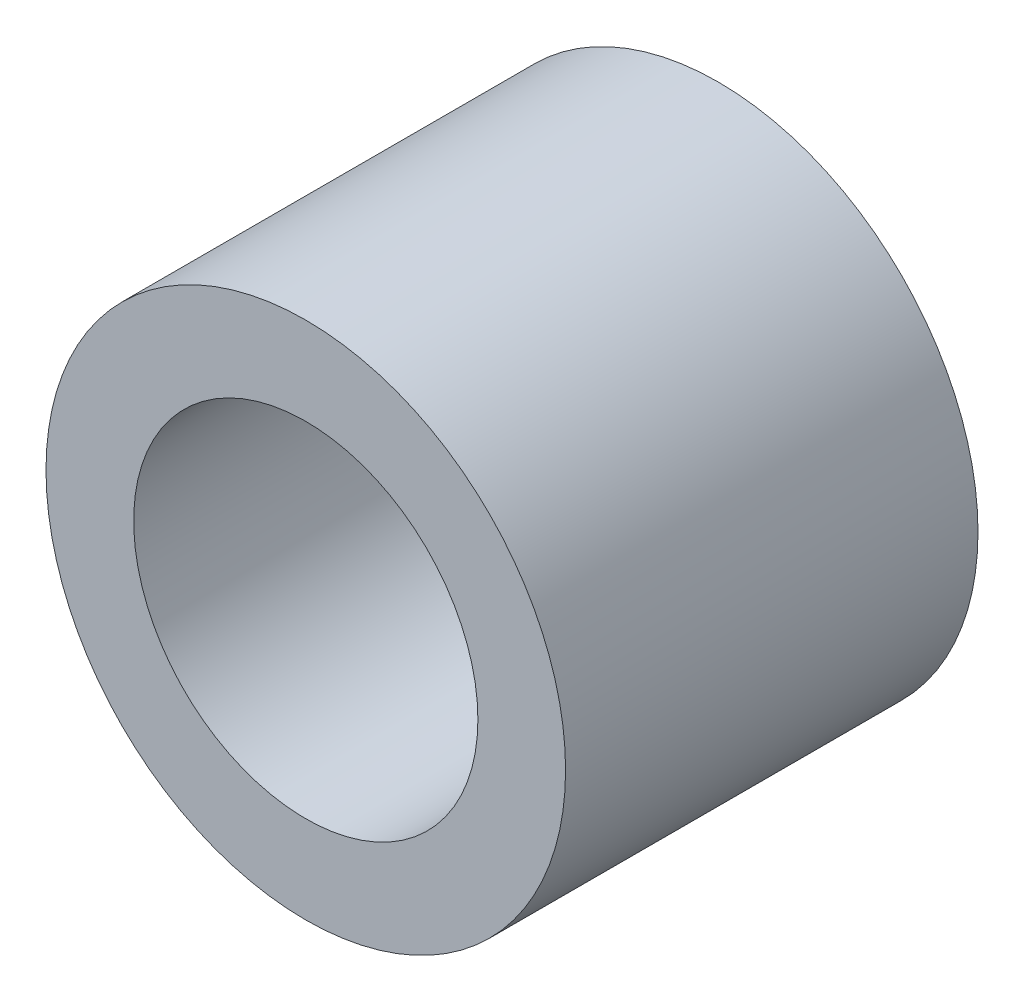
ISO-10303-21;
HEADER;
FILE_DESCRIPTION(('STEP AP214'),'2;1');
FILE_NAME('part.step','',(''),(''),'','','');
FILE_SCHEMA(('AUTOMOTIVE_DESIGN { 1 0 10303 214 1 1 1 1 }'));
ENDSEC;
DATA;
#1=APPLICATION_CONTEXT('core data for automotive mechanical design processes');
#2=APPLICATION_PROTOCOL_DEFINITION('international standard','automotive_design',2000,#1);
#3=PRODUCT_CONTEXT('',#1,'mechanical');
#4=PRODUCT('Part','Part','',(#3));
#5=PRODUCT_RELATED_PRODUCT_CATEGORY('part','',(#4));
#6=PRODUCT_DEFINITION_FORMATION('','',#4);
#7=PRODUCT_DEFINITION_CONTEXT('part definition',#1,'design');
#8=PRODUCT_DEFINITION('design','',#6,#7);
#9=PRODUCT_DEFINITION_SHAPE('','',#8);
#10=(LENGTH_UNIT() NAMED_UNIT(*) SI_UNIT(.MILLI.,.METRE.));
#11=(NAMED_UNIT(*) PLANE_ANGLE_UNIT() SI_UNIT($,.RADIAN.));
#12=(NAMED_UNIT(*) SI_UNIT($,.STERADIAN.) SOLID_ANGLE_UNIT());
#13=UNCERTAINTY_MEASURE_WITH_UNIT(LENGTH_MEASURE(1.E-05),#10,'distance_accuracy_value','');
#14=(GEOMETRIC_REPRESENTATION_CONTEXT(3) GLOBAL_UNCERTAINTY_ASSIGNED_CONTEXT((#13)) GLOBAL_UNIT_ASSIGNED_CONTEXT((#10,
#11,#12)) REPRESENTATION_CONTEXT('',''));
#15=CARTESIAN_POINT('',(0.,0.,0.));
#16=DIRECTION('',(0.,0.,1.));
#17=DIRECTION('',(1.,0.,0.));
#18=AXIS2_PLACEMENT_3D('',#15,#16,#17);
#19=CARTESIAN_POINT('',(0.,0.,6.35));
#20=DIRECTION('',(0.,0.,1.));
#21=DIRECTION('',(1.,0.,0.));
#22=AXIS2_PLACEMENT_3D('',#19,#20,#21);
#23=PLANE('',#22);
#24=CARTESIAN_POINT('',(0.,0.,6.35));
#25=DIRECTION('',(0.,0.,1.));
#26=DIRECTION('',(1.,0.,0.));
#27=AXIS2_PLACEMENT_3D('',#24,#25,#26);
#28=CIRCLE('',#27,4.);
#29=CARTESIAN_POINT('',(4.,0.,6.35));
#30=VERTEX_POINT('',#29);
#31=EDGE_CURVE('E10',#30,#30,#28,.T.);
#32=ORIENTED_EDGE('',*,*,#31,.T.);
#33=EDGE_LOOP('',(#32));
#34=FACE_BOUND('',#33,.T.);
#35=CARTESIAN_POINT('',(0.,0.,6.35));
#36=DIRECTION('',(0.,0.,1.));
#37=DIRECTION('',(1.,0.,0.));
#38=AXIS2_PLACEMENT_3D('',#35,#36,#37);
#39=CIRCLE('',#38,2.65);
#40=CARTESIAN_POINT('',(2.65,0.,6.35));
#41=VERTEX_POINT('',#40);
#42=EDGE_CURVE('E42',#41,#41,#39,.T.);
#43=ORIENTED_EDGE('',*,*,#42,.F.);
#44=EDGE_LOOP('',(#43));
#45=FACE_BOUND('',#44,.T.);
#46=ADVANCED_FACE('F31',(#34,#45),#23,.T.);
#47=CARTESIAN_POINT('',(0.,0.,0.));
#48=DIRECTION('',(0.,0.,1.));
#49=DIRECTION('',(1.,0.,0.));
#50=AXIS2_PLACEMENT_3D('',#47,#48,#49);
#51=PLANE('',#50);
#52=CARTESIAN_POINT('',(0.,0.,0.));
#53=DIRECTION('',(0.,0.,1.));
#54=DIRECTION('',(1.,0.,0.));
#55=AXIS2_PLACEMENT_3D('',#52,#53,#54);
#56=CIRCLE('',#55,4.);
#57=CARTESIAN_POINT('',(4.,0.,0.));
#58=VERTEX_POINT('',#57);
#59=EDGE_CURVE('E35',#58,#58,#56,.T.);
#60=ORIENTED_EDGE('',*,*,#59,.F.);
#61=EDGE_LOOP('',(#60));
#62=FACE_BOUND('',#61,.T.);
#63=CARTESIAN_POINT('',(0.,0.,0.));
#64=DIRECTION('',(0.,0.,1.));
#65=DIRECTION('',(1.,0.,0.));
#66=AXIS2_PLACEMENT_3D('',#63,#64,#65);
#67=CIRCLE('',#66,2.65);
#68=CARTESIAN_POINT('',(2.65,0.,0.));
#69=VERTEX_POINT('',#68);
#70=EDGE_CURVE('E44',#69,#69,#67,.T.);
#71=ORIENTED_EDGE('',*,*,#70,.T.);
#72=EDGE_LOOP('',(#71));
#73=FACE_BOUND('',#72,.T.);
#74=ADVANCED_FACE('F54',(#62,#73),#51,.F.);
#75=CARTESIAN_POINT('',(0.,0.,6.35));
#76=DIRECTION('',(0.,0.,-1.));
#77=DIRECTION('',(-1.,0.,0.));
#78=AXIS2_PLACEMENT_3D('',#75,#76,#77);
#79=CYLINDRICAL_SURFACE('',#78,4.);
#80=ORIENTED_EDGE('',*,*,#31,.F.);
#81=EDGE_LOOP('',(#80));
#82=FACE_BOUND('',#81,.T.);
#83=ORIENTED_EDGE('',*,*,#59,.T.);
#84=EDGE_LOOP('',(#83));
#85=FACE_BOUND('',#84,.T.);
#86=ADVANCED_FACE('F33',(#82,#85),#79,.T.);
#87=CARTESIAN_POINT('',(0.,0.,6.35));
#88=DIRECTION('',(0.,0.,-1.));
#89=DIRECTION('',(-1.,0.,0.));
#90=AXIS2_PLACEMENT_3D('',#87,#88,#89);
#91=CYLINDRICAL_SURFACE('',#90,2.65);
#92=ORIENTED_EDGE('',*,*,#42,.T.);
#93=EDGE_LOOP('',(#92));
#94=FACE_BOUND('',#93,.T.);
#95=ORIENTED_EDGE('',*,*,#70,.F.);
#96=EDGE_LOOP('',(#95));
#97=FACE_BOUND('',#96,.T.);
#98=ADVANCED_FACE('F50',(#94,#97),#91,.F.);
#99=CLOSED_SHELL('',(#46,#74,#86,#98));
#100=MANIFOLD_SOLID_BREP('B2',#99);
#101=ADVANCED_BREP_SHAPE_REPRESENTATION('',(#18,#100),#14);
#102=SHAPE_DEFINITION_REPRESENTATION(#9,#101);
ENDSEC;
END-ISO-10303-21;
